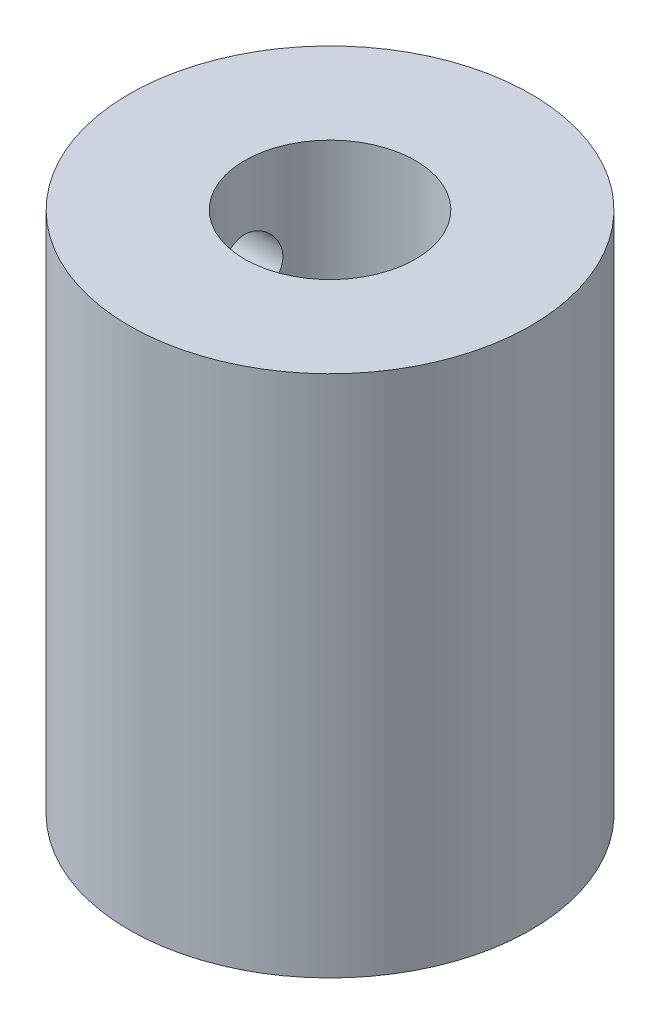
ISO-10303-21;
HEADER;
FILE_DESCRIPTION(('STEP AP214'),'2;1');
FILE_NAME('part.step','',(''),(''),'','','');
FILE_SCHEMA(('AUTOMOTIVE_DESIGN { 1 0 10303 214 1 1 1 1 }'));
ENDSEC;
DATA;
#1=APPLICATION_CONTEXT('core data for automotive mechanical design processes');
#2=APPLICATION_PROTOCOL_DEFINITION('international standard','automotive_design',2000,#1);
#3=PRODUCT_CONTEXT('',#1,'mechanical');
#4=PRODUCT('Part','Part','',(#3));
#5=PRODUCT_RELATED_PRODUCT_CATEGORY('part','',(#4));
#6=PRODUCT_DEFINITION_FORMATION('','',#4);
#7=PRODUCT_DEFINITION_CONTEXT('part definition',#1,'design');
#8=PRODUCT_DEFINITION('design','',#6,#7);
#9=PRODUCT_DEFINITION_SHAPE('','',#8);
#10=(LENGTH_UNIT() NAMED_UNIT(*) SI_UNIT(.MILLI.,.METRE.));
#11=(NAMED_UNIT(*) PLANE_ANGLE_UNIT() SI_UNIT($,.RADIAN.));
#12=(NAMED_UNIT(*) SI_UNIT($,.STERADIAN.) SOLID_ANGLE_UNIT());
#13=UNCERTAINTY_MEASURE_WITH_UNIT(LENGTH_MEASURE(1.E-05),#10,'distance_accuracy_value','');
#14=(GEOMETRIC_REPRESENTATION_CONTEXT(3) GLOBAL_UNCERTAINTY_ASSIGNED_CONTEXT((#13)) GLOBAL_UNIT_ASSIGNED_CONTEXT((#10,
#11,#12)) REPRESENTATION_CONTEXT('',''));
#15=CARTESIAN_POINT('',(0.,0.,0.));
#16=DIRECTION('',(0.,0.,1.));
#17=DIRECTION('',(1.,0.,0.));
#18=AXIS2_PLACEMENT_3D('',#15,#16,#17);
#19=CARTESIAN_POINT('',(0.,24.5,0.));
#20=DIRECTION('',(0.,1.,0.));
#21=DIRECTION('',(0.,0.,1.));
#22=AXIS2_PLACEMENT_3D('',#19,#20,#21);
#23=PLANE('',#22);
#24=CARTESIAN_POINT('',(0.,24.5,0.));
#25=DIRECTION('',(0.,1.,0.));
#26=DIRECTION('',(0.,0.,1.));
#27=AXIS2_PLACEMENT_3D('',#24,#25,#26);
#28=CIRCLE('',#27,9.4);
#29=CARTESIAN_POINT('',(0.,24.5,9.4));
#30=VERTEX_POINT('',#29);
#31=EDGE_CURVE('E10',#30,#30,#28,.T.);
#32=ORIENTED_EDGE('',*,*,#31,.T.);
#33=EDGE_LOOP('',(#32));
#34=FACE_BOUND('',#33,.T.);
#35=CARTESIAN_POINT('',(0.,24.5,0.));
#36=DIRECTION('',(0.,1.,0.));
#37=DIRECTION('',(0.,0.,1.));
#38=AXIS2_PLACEMENT_3D('',#35,#36,#37);
#39=CIRCLE('',#38,4.);
#40=CARTESIAN_POINT('',(0.,24.5,4.));
#41=VERTEX_POINT('',#40);
#42=EDGE_CURVE('E57',#41,#41,#39,.T.);
#43=ORIENTED_EDGE('',*,*,#42,.F.);
#44=EDGE_LOOP('',(#43));
#45=FACE_BOUND('',#44,.T.);
#46=ADVANCED_FACE('F36',(#34,#45),#23,.T.);
#47=CARTESIAN_POINT('',(0.,0.,0.));
#48=DIRECTION('',(0.,1.,0.));
#49=DIRECTION('',(0.,0.,1.));
#50=AXIS2_PLACEMENT_3D('',#47,#48,#49);
#51=PLANE('',#50);
#52=CARTESIAN_POINT('',(0.,0.,0.));
#53=DIRECTION('',(0.,1.,0.));
#54=DIRECTION('',(0.,0.,1.));
#55=AXIS2_PLACEMENT_3D('',#52,#53,#54);
#56=CIRCLE('',#55,9.4);
#57=CARTESIAN_POINT('',(0.,0.,9.4));
#58=VERTEX_POINT('',#57);
#59=EDGE_CURVE('E51',#58,#58,#56,.T.);
#60=ORIENTED_EDGE('',*,*,#59,.F.);
#61=EDGE_LOOP('',(#60));
#62=FACE_BOUND('',#61,.T.);
#63=CARTESIAN_POINT('',(0.,0.,0.));
#64=DIRECTION('',(0.,1.,0.));
#65=DIRECTION('',(0.,0.,1.));
#66=AXIS2_PLACEMENT_3D('',#63,#64,#65);
#67=CIRCLE('',#66,4.);
#68=CARTESIAN_POINT('',(0.,0.,4.));
#69=VERTEX_POINT('',#68);
#70=EDGE_CURVE('E60',#69,#69,#67,.T.);
#71=ORIENTED_EDGE('',*,*,#70,.T.);
#72=EDGE_LOOP('',(#71));
#73=FACE_BOUND('',#72,.T.);
#74=ADVANCED_FACE('F101',(#62,#73),#51,.F.);
#75=CARTESIAN_POINT('',(0.,24.5,0.));
#76=DIRECTION('',(0.,-1.,0.));
#77=DIRECTION('',(0.,0.,-1.));
#78=AXIS2_PLACEMENT_3D('',#75,#76,#77);
#79=CYLINDRICAL_SURFACE('',#78,9.4);
#80=CARTESIAN_POINT('',(-9.4,3.,0.));
#81=CARTESIAN_POINT('',(-9.39999860292908,3.00000339908655,-0.0836857789003803));
#82=CARTESIAN_POINT('',(-9.39887077859171,3.00702696122487,-0.167418496607772));
#83=CARTESIAN_POINT('',(-9.3944802410602,3.0349259578385,-0.332538987483233));
#84=CARTESIAN_POINT('',(-9.3912155141064,3.05581445852151,-0.413924473075796));
#85=CARTESIAN_POINT('',(-9.3829176603132,3.11079950047295,-0.571937358065425));
#86=CARTESIAN_POINT('',(-9.37788593234908,3.14488559583209,-0.648568465040697));
#87=CARTESIAN_POINT('',(-9.36660853273479,3.22527168016775,-0.795012930897301));
#88=CARTESIAN_POINT('',(-9.36036301292473,3.2715701416886,-0.864827140903446));
#89=CARTESIAN_POINT('',(-9.34728990872575,3.37550021958999,-0.996280738714871));
#90=CARTESIAN_POINT('',(-9.34045813044039,3.4332181576055,-1.05785146896413));
#91=CARTESIAN_POINT('',(-9.32701490899077,3.55816299563803,-1.17047757507708));
#92=CARTESIAN_POINT('',(-9.32040347920138,3.62539047157698,-1.22153231360512));
#93=CARTESIAN_POINT('',(-9.30810888738145,3.76791321194938,-1.31194891982853));
#94=CARTESIAN_POINT('',(-9.30243114543986,3.8432516532129,-1.35124352949974));
#95=CARTESIAN_POINT('',(-9.29270458436251,3.99956521487794,-1.41659447142563));
#96=CARTESIAN_POINT('',(-9.28865566456992,4.08053998660654,-1.44265162174584));
#97=CARTESIAN_POINT('',(-9.28268671586333,4.24510227182945,-1.48057299349724));
#98=CARTESIAN_POINT('',(-9.28074898071099,4.32866191384838,-1.49255532610323));
#99=CARTESIAN_POINT('',(-9.27916815661671,4.49662653562471,-1.5023529987421));
#100=CARTESIAN_POINT('',(-9.27952491875279,4.58103146016489,-1.50016925820927));
#101=CARTESIAN_POINT('',(-9.28247660212726,4.74745142467884,-1.48179311664287));
#102=CARTESIAN_POINT('',(-9.28505040396344,4.82948148910245,-1.46573289779084));
#103=CARTESIAN_POINT('',(-9.29211313549312,4.98966755740503,-1.42026690117827));
#104=CARTESIAN_POINT('',(-9.29660212585582,5.06782343847038,-1.39086070064291));
#105=CARTESIAN_POINT('',(-9.30701247834285,5.21844111988442,-1.31940194808493));
#106=CARTESIAN_POINT('',(-9.31294008917152,5.29087620112074,-1.27729402636579));
#107=CARTESIAN_POINT('',(-9.32555537605936,5.4277026315064,-1.18166648494931));
#108=CARTESIAN_POINT('',(-9.33224310843869,5.49209338387938,-1.12814601939762));
#109=CARTESIAN_POINT('',(-9.34571812525718,5.61176889026108,-1.01049009104128));
#110=CARTESIAN_POINT('',(-9.35250567847568,5.66694207592851,-0.94624111357437));
#111=CARTESIAN_POINT('',(-9.36534529074403,5.7657405797876,-0.809337166246673));
#112=CARTESIAN_POINT('',(-9.37139734575783,5.80936583461171,-0.736682150262153));
#113=CARTESIAN_POINT('',(-9.38209162704905,5.88383832828381,-0.584927224574365));
#114=CARTESIAN_POINT('',(-9.38673282558863,5.91467625813522,-0.505822669649441));
#115=CARTESIAN_POINT('',(-9.39407406616499,5.96259806029723,-0.343466737257515));
#116=CARTESIAN_POINT('',(-9.39677425690949,5.97968298628799,-0.260215677992101));
#117=CARTESIAN_POINT('',(-9.3999093795552,5.9994638239439,-0.0928921103699813));
#118=CARTESIAN_POINT('',(-9.40036843752436,6.00231299312803,-0.00883815585294559));
#119=CARTESIAN_POINT('',(-9.3990354729032,5.99394924295871,0.158546581234478));
#120=CARTESIAN_POINT('',(-9.39724352948276,5.98273681816502,0.241877389134836));
#121=CARTESIAN_POINT('',(-9.39162483366102,5.94669562180877,0.404981005546032));
#122=CARTESIAN_POINT('',(-9.38780934440858,5.92194219631544,0.484770884780166));
#123=CARTESIAN_POINT('',(-9.37856979195967,5.85960159951161,0.639068121481985));
#124=CARTESIAN_POINT('',(-9.3731456447838,5.82201375816952,0.713575202911422));
#125=CARTESIAN_POINT('',(-9.36123104450446,5.73471656643136,0.855861163626058));
#126=CARTESIAN_POINT('',(-9.35473225361117,5.68491083200475,0.923580196715583));
#127=CARTESIAN_POINT('',(-9.34141584789389,5.574724941677,1.04975357394106));
#128=CARTESIAN_POINT('',(-9.33459821197453,5.51434408537934,1.10820730394176));
#129=CARTESIAN_POINT('',(-9.32133515201758,5.38403677519269,1.21475432308297));
#130=CARTESIAN_POINT('',(-9.31489385732774,5.31402545535134,1.26274441475431));
#131=CARTESIAN_POINT('',(-9.30318815198079,5.16684513267429,1.34628266474539));
#132=CARTESIAN_POINT('',(-9.29792370634545,5.08967634266899,1.38183119287037));
#133=CARTESIAN_POINT('',(-9.28919827524588,4.93066855257304,1.43932041741957));
#134=CARTESIAN_POINT('',(-9.28573032022974,4.84884898829733,1.46131376569598));
#135=CARTESIAN_POINT('',(-9.2809725798083,4.68261743718157,1.49123486875253));
#136=CARTESIAN_POINT('',(-9.27968262224987,4.59820565577244,1.49916373521905));
#137=CARTESIAN_POINT('',(-9.27943392099984,4.43021544664552,1.50070178740011));
#138=CARTESIAN_POINT('',(-9.28044874617022,4.34663849973592,1.49447332796677));
#139=CARTESIAN_POINT('',(-9.28463755016577,4.18173752238263,1.46822321800111));
#140=CARTESIAN_POINT('',(-9.287811523616,4.10041348633113,1.44820160180518));
#141=CARTESIAN_POINT('',(-9.2959513032301,3.94238183457247,1.39499364428432));
#142=CARTESIAN_POINT('',(-9.30091536252848,3.86566980307003,1.36182013418357));
#143=CARTESIAN_POINT('',(-9.31207786158743,3.71887382095289,1.28326648968871));
#144=CARTESIAN_POINT('',(-9.31827635413694,3.64879015398064,1.23788583324282));
#145=CARTESIAN_POINT('',(-9.33129362625975,3.51641799859779,1.13562205521819));
#146=CARTESIAN_POINT('',(-9.33811842228315,3.45422264607109,1.07861912688003));
#147=CARTESIAN_POINT('',(-9.35157035726145,3.34022375448953,0.954981945128727));
#148=CARTESIAN_POINT('',(-9.3581974501104,3.28842262356852,0.88834546595213));
#149=CARTESIAN_POINT('',(-9.37055524925498,3.19638795348418,0.746837235944878));
#150=CARTESIAN_POINT('',(-9.37628006375307,3.15622911582005,0.671916387125346));
#151=CARTESIAN_POINT('',(-9.38613080657795,3.08912723429793,0.516333748405034));
#152=CARTESIAN_POINT('',(-9.39025835436346,3.06217079720164,0.435677871978858));
#153=CARTESIAN_POINT('',(-9.39553054266368,3.02820615337028,0.295572402618494));
#154=CARTESIAN_POINT('',(-9.39719778508943,3.01764544341047,0.236978205994379));
#155=CARTESIAN_POINT('',(-9.39943300196921,3.00354121149885,0.118930567589197));
#156=CARTESIAN_POINT('',(-9.40000099292594,2.99999758420194,0.0594771387209914));
#157=CARTESIAN_POINT('',(-9.4,3.,0.));
#158=B_SPLINE_CURVE_WITH_KNOTS('',3,(#80,#81,#82,#83,#84,#85,#86,#87,#88,#89,#90,#91,#92,#93,
#94,#95,#96,#97,#98,#99,#100,#101,#102,#103,#104,#105,#106,#107,#108,#109,#110,#111,#112,#113,
#114,#115,#116,#117,#118,#119,#120,#121,#122,#123,#124,#125,#126,#127,#128,#129,#130,#131,#132,
#133,#134,#135,#136,#137,#138,#139,#140,#141,#142,#143,#144,#145,#146,#147,#148,#149,#150,#151,
#152,#153,#154,#155,#156,#157),.UNSPECIFIED.,.T.,.F.,(4,2,2,2,2,2,2,2,2,2,2,2,2,2,2,2,2,2,2,2,2,
2,2,2,2,2,2,2,2,2,2,2,2,2,2,2,2,2,4),(0.,0.250839961665604,0.50191664917309,0.752795014147739,
1.00364201550154,1.25646311863702,1.50929953982558,1.76355549094707,2.0177957273208,
2.26988686702206,2.52196164517307,2.77166139768042,3.02136906074377,3.27218138553335,
3.52301230604393,3.77668826525693,4.0303656164498,4.2842273184147,4.53806956902889,
4.78917305817339,5.04026771601461,5.28997921531406,5.53970375300837,5.79146550750159,
6.04324394263323,6.29740324834593,6.5515549989451,6.80471323165459,7.05785145331003,
7.30810137611369,7.55835067595277,7.80835642652347,8.05837287056011,8.3111102507431,
8.56390611770033,8.81828983379431,9.07241495181823,9.2506945517148,9.42897147513942),.UNSPECIFIED.);
#159=CARTESIAN_POINT('',(-9.4,3.,0.));
#160=VERTEX_POINT('',#159);
#161=EDGE_CURVE('E87',#160,#160,#158,.T.);
#162=ORIENTED_EDGE('',*,*,#161,.T.);
#163=EDGE_LOOP('',(#162));
#164=FACE_BOUND('',#163,.T.);
#165=CARTESIAN_POINT('',(-9.4,18.5,0.));
#166=CARTESIAN_POINT('',(-9.39999860292908,18.5000033990866,-0.0836857789003804));
#167=CARTESIAN_POINT('',(-9.39887077859171,18.5070269612249,-0.167418496607772));
#168=CARTESIAN_POINT('',(-9.3944802410602,18.5349259578385,-0.332538987483233));
#169=CARTESIAN_POINT('',(-9.3912155141064,18.5558144585215,-0.413924473075796));
#170=CARTESIAN_POINT('',(-9.3829176603132,18.610799500473,-0.571937358065426));
#171=CARTESIAN_POINT('',(-9.37788593234908,18.6448855958321,-0.648568465040698));
#172=CARTESIAN_POINT('',(-9.36660853273479,18.7252716801677,-0.795012930897303));
#173=CARTESIAN_POINT('',(-9.36036301292473,18.7715701416886,-0.864827140903447));
#174=CARTESIAN_POINT('',(-9.34728990872575,18.87550021959,-0.996280738714872));
#175=CARTESIAN_POINT('',(-9.34045813044039,18.9332181576055,-1.05785146896413));
#176=CARTESIAN_POINT('',(-9.32701490899077,19.058162995638,-1.17047757507708));
#177=CARTESIAN_POINT('',(-9.32040347920138,19.125390471577,-1.22153231360512));
#178=CARTESIAN_POINT('',(-9.30810888738145,19.2679132119494,-1.31194891982853));
#179=CARTESIAN_POINT('',(-9.30243114543986,19.3432516532129,-1.35124352949974));
#180=CARTESIAN_POINT('',(-9.29270458436251,19.4995652148779,-1.41659447142564));
#181=CARTESIAN_POINT('',(-9.28865566456992,19.5805399866065,-1.44265162174584));
#182=CARTESIAN_POINT('',(-9.28268671586333,19.7451022718294,-1.48057299349724));
#183=CARTESIAN_POINT('',(-9.28074898071099,19.8286619138484,-1.49255532610323));
#184=CARTESIAN_POINT('',(-9.27916815661671,19.9966265356247,-1.5023529987421));
#185=CARTESIAN_POINT('',(-9.27952491875279,20.0810314601649,-1.50016925820927));
#186=CARTESIAN_POINT('',(-9.28247660212726,20.2474514246788,-1.48179311664287));
#187=CARTESIAN_POINT('',(-9.28505040396344,20.3294814891024,-1.46573289779084));
#188=CARTESIAN_POINT('',(-9.29211313549312,20.489667557405,-1.42026690117827));
#189=CARTESIAN_POINT('',(-9.29660212585582,20.5678234384704,-1.39086070064291));
#190=CARTESIAN_POINT('',(-9.30701247834285,20.7184411198844,-1.31940194808493));
#191=CARTESIAN_POINT('',(-9.31294008917152,20.7908762011207,-1.27729402636579));
#192=CARTESIAN_POINT('',(-9.32555537605936,20.9277026315064,-1.18166648494931));
#193=CARTESIAN_POINT('',(-9.33224310843869,20.9920933838794,-1.12814601939762));
#194=CARTESIAN_POINT('',(-9.34571812525718,21.1117688902611,-1.01049009104127));
#195=CARTESIAN_POINT('',(-9.35250567847568,21.1669420759285,-0.946241113574369));
#196=CARTESIAN_POINT('',(-9.36534529074403,21.2657405797876,-0.809337166246673));
#197=CARTESIAN_POINT('',(-9.37139734575783,21.3093658346117,-0.736682150262153));
#198=CARTESIAN_POINT('',(-9.38209162704905,21.3838383282838,-0.584927224574364));
#199=CARTESIAN_POINT('',(-9.38673282558863,21.4146762581352,-0.50582266964944));
#200=CARTESIAN_POINT('',(-9.39407406616499,21.4625980602972,-0.343466737257514));
#201=CARTESIAN_POINT('',(-9.39677425690949,21.479682986288,-0.2602156779921));
#202=CARTESIAN_POINT('',(-9.3999093795552,21.4994638239439,-0.0928921103699806));
#203=CARTESIAN_POINT('',(-9.40036843752436,21.502312993128,-0.00883815585294493));
#204=CARTESIAN_POINT('',(-9.3990354729032,21.4939492429587,0.158546581234479));
#205=CARTESIAN_POINT('',(-9.39724352948276,21.482736818165,0.241877389134837));
#206=CARTESIAN_POINT('',(-9.39162483366102,21.4466956218088,0.404981005546033));
#207=CARTESIAN_POINT('',(-9.38780934440858,21.4219421963154,0.484770884780167));
#208=CARTESIAN_POINT('',(-9.37856979195967,21.3596015995116,0.639068121481986));
#209=CARTESIAN_POINT('',(-9.3731456447838,21.3220137581695,0.713575202911423));
#210=CARTESIAN_POINT('',(-9.36123104450446,21.2347165664314,0.855861163626059));
#211=CARTESIAN_POINT('',(-9.35473225361117,21.1849108320047,0.923580196715583));
#212=CARTESIAN_POINT('',(-9.34141584789389,21.074724941677,1.04975357394106));
#213=CARTESIAN_POINT('',(-9.33459821197453,21.0143440853793,1.10820730394176));
#214=CARTESIAN_POINT('',(-9.32133515201758,20.8840367751927,1.21475432308297));
#215=CARTESIAN_POINT('',(-9.31489385732774,20.8140254553513,1.26274441475431));
#216=CARTESIAN_POINT('',(-9.30318815198079,20.6668451326743,1.34628266474539));
#217=CARTESIAN_POINT('',(-9.29792370634545,20.589676342669,1.38183119287038));
#218=CARTESIAN_POINT('',(-9.28919827524588,20.430668552573,1.43932041741957));
#219=CARTESIAN_POINT('',(-9.28573032022974,20.3488489882973,1.46131376569598));
#220=CARTESIAN_POINT('',(-9.2809725798083,20.1826174371816,1.49123486875253));
#221=CARTESIAN_POINT('',(-9.27968262224987,20.0982056557724,1.49916373521905));
#222=CARTESIAN_POINT('',(-9.27943392099984,19.9302154466455,1.50070178740011));
#223=CARTESIAN_POINT('',(-9.28044874617022,19.8466384997359,1.49447332796677));
#224=CARTESIAN_POINT('',(-9.28463755016577,19.6817375223826,1.46822321800111));
#225=CARTESIAN_POINT('',(-9.287811523616,19.6004134863311,1.44820160180518));
#226=CARTESIAN_POINT('',(-9.2959513032301,19.4423818345725,1.39499364428432));
#227=CARTESIAN_POINT('',(-9.30091536252848,19.36566980307,1.36182013418357));
#228=CARTESIAN_POINT('',(-9.31207786158743,19.2188738209529,1.28326648968871));
#229=CARTESIAN_POINT('',(-9.31827635413694,19.1487901539806,1.23788583324282));
#230=CARTESIAN_POINT('',(-9.33129362625975,19.0164179985978,1.13562205521819));
#231=CARTESIAN_POINT('',(-9.33811842228315,18.9542226460711,1.07861912688003));
#232=CARTESIAN_POINT('',(-9.35157035726145,18.8402237544895,0.954981945128728));
#233=CARTESIAN_POINT('',(-9.3581974501104,18.7884226235685,0.88834546595213));
#234=CARTESIAN_POINT('',(-9.37055524925498,18.6963879534842,0.746837235944877));
#235=CARTESIAN_POINT('',(-9.37628006375307,18.6562291158201,0.671916387125345));
#236=CARTESIAN_POINT('',(-9.38613080657795,18.5891272342979,0.516333748405034));
#237=CARTESIAN_POINT('',(-9.39025835436346,18.5621707972016,0.435677871978858));
#238=CARTESIAN_POINT('',(-9.39553054266368,18.5282061533703,0.295572402618495));
#239=CARTESIAN_POINT('',(-9.39719778508943,18.5176454434105,0.23697820599438));
#240=CARTESIAN_POINT('',(-9.39943300196921,18.5035412114988,0.118930567589197));
#241=CARTESIAN_POINT('',(-9.40000099292594,18.4999975842019,0.0594771387209916));
#242=CARTESIAN_POINT('',(-9.4,18.5,0.));
#243=B_SPLINE_CURVE_WITH_KNOTS('',3,(#165,#166,#167,#168,#169,#170,#171,#172,#173,#174,#175,
#176,#177,#178,#179,#180,#181,#182,#183,#184,#185,#186,#187,#188,#189,#190,#191,#192,#193,#194,
#195,#196,#197,#198,#199,#200,#201,#202,#203,#204,#205,#206,#207,#208,#209,#210,#211,#212,#213,
#214,#215,#216,#217,#218,#219,#220,#221,#222,#223,#224,#225,#226,#227,#228,#229,#230,#231,#232,
#233,#234,#235,#236,#237,#238,#239,#240,#241,#242),.UNSPECIFIED.,.T.,.F.,(4,2,2,2,2,2,2,2,2,2,2,
2,2,2,2,2,2,2,2,2,2,2,2,2,2,2,2,2,2,2,2,2,2,2,2,2,2,2,4),(0.,0.250839961665604,
0.501916649173092,0.75279501414774,1.00364201550154,1.25646311863703,1.50929953982558,
1.76355549094707,2.0177957273208,2.26988686702206,2.52196164517307,2.77166139768042,
3.02136906074377,3.27218138553335,3.52301230604394,3.77668826525693,4.0303656164498,
4.2842273184147,4.53806956902889,4.7891730581734,5.04026771601461,5.28997921531406,
5.53970375300837,5.79146550750159,6.04324394263324,6.29740324834594,6.55155499894511,
6.8047132316546,7.05785145331004,7.30810137611369,7.55835067595278,7.80835642652348,
8.05837287056012,8.31111025074311,8.56390611770034,8.81828983379431,9.07241495181824,
9.2506945517148,9.42897147513943),.UNSPECIFIED.);
#244=CARTESIAN_POINT('',(-9.4,18.5,0.));
#245=VERTEX_POINT('',#244);
#246=EDGE_CURVE('E69',#245,#245,#243,.T.);
#247=ORIENTED_EDGE('',*,*,#246,.T.);
#248=EDGE_LOOP('',(#247));
#249=FACE_BOUND('',#248,.T.);
#250=ORIENTED_EDGE('',*,*,#31,.F.);
#251=EDGE_LOOP('',(#250));
#252=FACE_BOUND('',#251,.T.);
#253=ORIENTED_EDGE('',*,*,#59,.T.);
#254=EDGE_LOOP('',(#253));
#255=FACE_BOUND('',#254,.T.);
#256=ADVANCED_FACE('F38',(#164,#249,#252,#255),#79,.T.);
#257=CARTESIAN_POINT('',(0.,24.5,0.));
#258=DIRECTION('',(0.,-1.,0.));
#259=DIRECTION('',(0.,0.,-1.));
#260=AXIS2_PLACEMENT_3D('',#257,#258,#259);
#261=CYLINDRICAL_SURFACE('',#260,4.);
#262=CARTESIAN_POINT('',(-3.70809924354783,4.5,-1.5));
#263=CARTESIAN_POINT('',(-3.70809640633806,4.58100748372079,-1.50000304106109));
#264=CARTESIAN_POINT('',(-3.71078260240986,4.66199492250364,-1.49341597549487));
#265=CARTESIAN_POINT('',(-3.72116159304967,4.8215280829132,-1.46736187895468));
#266=CARTESIAN_POINT('',(-3.72885423767112,4.90007387759501,-1.44789523373263));
#267=CARTESIAN_POINT('',(-3.748254802809,5.05237537161353,-1.39689657610574));
#268=CARTESIAN_POINT('',(-3.7599530956926,5.12614205665108,-1.36539347266348));
#269=CARTESIAN_POINT('',(-3.78603134206598,5.26737189681884,-1.29131856742698));
#270=CARTESIAN_POINT('',(-3.80041210067323,5.33483315028252,-1.24874344095039));
#271=CARTESIAN_POINT('',(-3.83103574665713,5.46489031162282,-1.15146661374162));
#272=CARTESIAN_POINT('',(-3.84733341923603,5.52712852962939,-1.09630381213306));
#273=CARTESIAN_POINT('',(-3.87949750628547,5.64172281467149,-0.976395839778925));
#274=CARTESIAN_POINT('',(-3.89536382814785,5.69407677374185,-0.911648630256679));
#275=CARTESIAN_POINT('',(-3.92552873936553,5.78913951229561,-0.7716946551776));
#276=CARTESIAN_POINT('',(-3.93975561223505,5.83145947471586,-0.696206947538027));
#277=CARTESIAN_POINT('',(-3.96438007973848,5.90265117252491,-0.538555771965246));
#278=CARTESIAN_POINT('',(-3.97477900217006,5.93152757199197,-0.456394630933535));
#279=CARTESIAN_POINT('',(-3.9901869710344,5.97375789577462,-0.291489341676831));
#280=CARTESIAN_POINT('',(-3.99540915214774,5.98772762744046,-0.208923197281595));
#281=CARTESIAN_POINT('',(-4.0006401410794,6.00172120094499,-0.042464363794785));
#282=CARTESIAN_POINT('',(-4.00065064414902,6.00174957761871,0.0414278850628339));
#283=CARTESIAN_POINT('',(-3.99559265903894,5.98821823853483,0.203743543064477));
#284=CARTESIAN_POINT('',(-3.99077541996683,5.97533070205119,0.282232178266901));
#285=CARTESIAN_POINT('',(-3.97693274932263,5.93746408477445,0.435839217984392));
#286=CARTESIAN_POINT('',(-3.96790701975577,5.91248414773796,0.510957383430299));
#287=CARTESIAN_POINT('',(-3.9463776916753,5.85082954832415,0.656989017303105));
#288=CARTESIAN_POINT('',(-3.93382539470077,5.81398999473159,0.72782539228731));
#289=CARTESIAN_POINT('',(-3.90651310225279,5.72980790307061,0.86248660795756));
#290=CARTESIAN_POINT('',(-3.8917523951284,5.6824619769824,0.926309176932323));
#291=CARTESIAN_POINT('',(-3.86052529655816,5.57537271371681,1.04909048680094));
#292=CARTESIAN_POINT('',(-3.84400963763883,5.51506608434957,1.10754614526348));
#293=CARTESIAN_POINT('',(-3.81182460645722,5.38540700667844,1.21370395569342));
#294=CARTESIAN_POINT('',(-3.79615544748847,5.31605229341336,1.261403406929));
#295=CARTESIAN_POINT('',(-3.76712703500335,5.16828053253718,1.34565611808152));
#296=CARTESIAN_POINT('',(-3.75382677150277,5.08969650631393,1.38193847851831));
#297=CARTESIAN_POINT('',(-3.73172438629002,4.92690377483243,1.44056464441501));
#298=CARTESIAN_POINT('',(-3.72291976205783,4.84269822840631,1.46291620605595));
#299=CARTESIAN_POINT('',(-3.71139597222848,4.67602403768405,1.49190191709668));
#300=CARTESIAN_POINT('',(-3.70836785241537,4.59371589446386,1.49933521158966));
#301=CARTESIAN_POINT('',(-3.70786539525016,4.42899064325826,1.50057885636272));
#302=CARTESIAN_POINT('',(-3.71038967003987,4.34657356764753,1.49439261093762));
#303=CARTESIAN_POINT('',(-3.72039381629735,4.18807007771232,1.46929733520157));
#304=CARTESIAN_POINT('',(-3.72763276216449,4.11186886423534,1.45100618334224));
#305=CARTESIAN_POINT('',(-3.74596487046362,3.9636520552798,1.40299774640637));
#306=CARTESIAN_POINT('',(-3.75705882250173,3.89163732083186,1.37327812034623));
#307=CARTESIAN_POINT('',(-3.7823624311608,3.75083556192379,1.30200292275278));
#308=CARTESIAN_POINT('',(-3.79667328892065,3.68227070786266,1.26004545177047));
#309=CARTESIAN_POINT('',(-3.82662814294291,3.55287101827396,1.16591317862479));
#310=CARTESIAN_POINT('',(-3.84227262594077,3.49203902537537,1.11373463696435));
#311=CARTESIAN_POINT('',(-3.87433046553184,3.3758316268049,0.996727340900938));
#312=CARTESIAN_POINT('',(-3.89072969357028,3.32104659123125,0.931306341491061));
#313=CARTESIAN_POINT('',(-3.92149874963302,3.22316163241056,0.79179747175315));
#314=CARTESIAN_POINT('',(-3.93586857107664,3.18006174705416,0.717709573322673));
#315=CARTESIAN_POINT('',(-3.96094985704552,3.10705394380039,0.563016329468476));
#316=CARTESIAN_POINT('',(-3.9716738133801,3.0771008762074,0.482434433064626));
#317=CARTESIAN_POINT('',(-3.98829436712571,3.03134358615008,0.316881887523254));
#318=CARTESIAN_POINT('',(-3.99419323299412,3.0155327145776,0.231913320723592));
#319=CARTESIAN_POINT('',(-4.00028407317073,2.99922559724517,0.0653355852738143));
#320=CARTESIAN_POINT('',(-4.00078860953764,2.99789051694101,-0.0161807680608464));
#321=CARTESIAN_POINT('',(-3.99684889809223,3.00841515944539,-0.178226786412425));
#322=CARTESIAN_POINT('',(-3.9924052471313,3.02027329088586,-0.258756569245258));
#323=CARTESIAN_POINT('',(-3.97921089603771,3.05625885149362,-0.414548248377127));
#324=CARTESIAN_POINT('',(-3.97056791378017,3.08007990587836,-0.489890731068835));
#325=CARTESIAN_POINT('',(-3.9498778362099,3.13901001338436,-0.63551547300639));
#326=CARTESIAN_POINT('',(-3.93783009655664,3.17412120330475,-0.705796771275543));
#327=CARTESIAN_POINT('',(-3.91090618300074,3.25631394350481,-0.842540176994414));
#328=CARTESIAN_POINT('',(-3.89593240108828,3.30383664051415,-0.908717548846851));
#329=CARTESIAN_POINT('',(-3.86499507694844,3.40880783018761,-1.03241734752336));
#330=CARTESIAN_POINT('',(-3.84903118274027,3.46625986580788,-1.0899366712559));
#331=CARTESIAN_POINT('',(-3.81688129739175,3.59306413164506,-1.19781214236196));
#332=CARTESIAN_POINT('',(-3.8007280534916,3.66288440215431,-1.24762999816025));
#333=CARTESIAN_POINT('',(-3.77098325003638,3.81041586957333,-1.33484709556843));
#334=CARTESIAN_POINT('',(-3.75739195631216,3.88812788405348,-1.37224504878157));
#335=CARTESIAN_POINT('',(-3.73402269853266,4.05295568097541,-1.4346588697426));
#336=CARTESIAN_POINT('',(-3.7244380329086,4.14033436651178,-1.45906002899523));
#337=CARTESIAN_POINT('',(-3.71147994336315,4.31848527195579,-1.49172356722079));
#338=CARTESIAN_POINT('',(-3.70810242179736,4.40925521270999,-1.49999659339571));
#339=CARTESIAN_POINT('',(-3.70809924354783,4.5,-1.5));
#340=B_SPLINE_CURVE_WITH_KNOTS('',3,(#262,#263,#264,#265,#266,#267,#268,#269,#270,#271,#272,
#273,#274,#275,#276,#277,#278,#279,#280,#281,#282,#283,#284,#285,#286,#287,#288,#289,#290,#291,
#292,#293,#294,#295,#296,#297,#298,#299,#300,#301,#302,#303,#304,#305,#306,#307,#308,#309,#310,
#311,#312,#313,#314,#315,#316,#317,#318,#319,#320,#321,#322,#323,#324,#325,#326,#327,#328,#329,
#330,#331,#332,#333,#334,#335,#336,#337,#338,#339),.UNSPECIFIED.,.T.,.F.,(4,2,2,2,2,2,2,2,2,2,2,
2,2,2,2,2,2,2,2,2,2,2,2,2,2,2,2,2,2,2,2,2,2,2,2,2,2,2,4),(0.,0.24268454141617,0.485361814598855,
0.72745985675703,0.969630679682933,1.22274652401128,1.47591628822983,1.73770072136421,
1.9993942638133,2.24980018489679,2.50012465404857,2.73806472803194,2.97602165263335,
3.21744131210668,3.45893893628976,3.71456675065875,3.97025867827335,4.23162592252967,
4.49284751635474,4.73965657740485,4.98640395388885,5.22143845928199,5.45652113429526,
5.70041561005822,5.94439948466355,6.20385016993624,6.46330169650178,6.72185508890168,
6.98028685560127,7.22365720549936,7.4669982031948,7.7044027400389,7.94185223512831,
8.18928323676987,8.43680270894965,8.69738599542079,8.95799630544242,9.23003178870926,
9.50188762323053),.UNSPECIFIED.);
#341=CARTESIAN_POINT('',(-3.70809924354783,4.5,-1.5));
#342=VERTEX_POINT('',#341);
#343=EDGE_CURVE('E41',#342,#342,#340,.T.);
#344=ORIENTED_EDGE('',*,*,#343,.F.);
#345=EDGE_LOOP('',(#344));
#346=FACE_BOUND('',#345,.T.);
#347=CARTESIAN_POINT('',(-3.70809924354783,20.,-1.5));
#348=CARTESIAN_POINT('',(-3.70809640633806,20.0810074837208,-1.50000304106109));
#349=CARTESIAN_POINT('',(-3.71078260240986,20.1619949225036,-1.49341597549487));
#350=CARTESIAN_POINT('',(-3.72116159304967,20.3215280829132,-1.46736187895468));
#351=CARTESIAN_POINT('',(-3.72885423767112,20.400073877595,-1.44789523373263));
#352=CARTESIAN_POINT('',(-3.748254802809,20.5523753716135,-1.39689657610574));
#353=CARTESIAN_POINT('',(-3.7599530956926,20.6261420566511,-1.36539347266348));
#354=CARTESIAN_POINT('',(-3.78603134206598,20.7673718968188,-1.29131856742698));
#355=CARTESIAN_POINT('',(-3.80041210067323,20.8348331502825,-1.24874344095039));
#356=CARTESIAN_POINT('',(-3.83103574665713,20.9648903116228,-1.15146661374162));
#357=CARTESIAN_POINT('',(-3.84733341923603,21.0271285296294,-1.09630381213306));
#358=CARTESIAN_POINT('',(-3.87949750628547,21.1417228146715,-0.976395839778928));
#359=CARTESIAN_POINT('',(-3.89536382814785,21.1940767737419,-0.911648630256682));
#360=CARTESIAN_POINT('',(-3.92552873936553,21.2891395122956,-0.771694655177603));
#361=CARTESIAN_POINT('',(-3.93975561223505,21.3314594747159,-0.69620694753803));
#362=CARTESIAN_POINT('',(-3.96438007973847,21.4026511725249,-0.53855577196525));
#363=CARTESIAN_POINT('',(-3.97477900217006,21.431527571992,-0.456394630933538));
#364=CARTESIAN_POINT('',(-3.9901869710344,21.4737578957746,-0.291489341676833));
#365=CARTESIAN_POINT('',(-3.99540915214774,21.4877276274405,-0.208923197281597));
#366=CARTESIAN_POINT('',(-4.0006401410794,21.501721200945,-0.0424643637947866));
#367=CARTESIAN_POINT('',(-4.00065064414902,21.5017495776187,0.0414278850628326));
#368=CARTESIAN_POINT('',(-3.99559265903894,21.4882182385348,0.203743543064476));
#369=CARTESIAN_POINT('',(-3.99077541996683,21.4753307020512,0.2822321782669));
#370=CARTESIAN_POINT('',(-3.97693274932263,21.4374640847744,0.435839217984391));
#371=CARTESIAN_POINT('',(-3.96790701975577,21.412484147738,0.510957383430298));
#372=CARTESIAN_POINT('',(-3.94637769167531,21.3508295483242,0.656989017303104));
#373=CARTESIAN_POINT('',(-3.93382539470077,21.3139899947316,0.72782539228731));
#374=CARTESIAN_POINT('',(-3.90651310225279,21.2298079030706,0.862486607957561));
#375=CARTESIAN_POINT('',(-3.8917523951284,21.1824619769824,0.926309176932324));
#376=CARTESIAN_POINT('',(-3.86052529655816,21.0753727137168,1.04909048680094));
#377=CARTESIAN_POINT('',(-3.84400963763883,21.0150660843496,1.10754614526348));
#378=CARTESIAN_POINT('',(-3.81182460645722,20.8854070066784,1.21370395569343));
#379=CARTESIAN_POINT('',(-3.79615544748847,20.8160522934134,1.261403406929));
#380=CARTESIAN_POINT('',(-3.76712703500335,20.6682805325372,1.34565611808152));
#381=CARTESIAN_POINT('',(-3.75382677150277,20.5896965063139,1.38193847851831));
#382=CARTESIAN_POINT('',(-3.73172438629002,20.4269037748324,1.44056464441501));
#383=CARTESIAN_POINT('',(-3.72291976205783,20.3426982284063,1.46291620605595));
#384=CARTESIAN_POINT('',(-3.71139597222848,20.176024037684,1.49190191709668));
#385=CARTESIAN_POINT('',(-3.70836785241537,20.0937158944639,1.49933521158966));
#386=CARTESIAN_POINT('',(-3.70786539525016,19.9289906432583,1.50057885636272));
#387=CARTESIAN_POINT('',(-3.71038967003987,19.8465735676475,1.49439261093762));
#388=CARTESIAN_POINT('',(-3.72039381629735,19.6880700777123,1.46929733520157));
#389=CARTESIAN_POINT('',(-3.72763276216449,19.6118688642353,1.45100618334225));
#390=CARTESIAN_POINT('',(-3.74596487046361,19.4636520552798,1.40299774640638));
#391=CARTESIAN_POINT('',(-3.75705882250172,19.3916373208319,1.37327812034623));
#392=CARTESIAN_POINT('',(-3.7823624311608,19.2508355619238,1.30200292275278));
#393=CARTESIAN_POINT('',(-3.79667328892065,19.1822707078627,1.26004545177047));
#394=CARTESIAN_POINT('',(-3.82662814294291,19.052871018274,1.16591317862479));
#395=CARTESIAN_POINT('',(-3.84227262594077,18.9920390253754,1.11373463696435));
#396=CARTESIAN_POINT('',(-3.87433046553184,18.8758316268049,0.996727340900939));
#397=CARTESIAN_POINT('',(-3.89072969357027,18.8210465912312,0.931306341491063));
#398=CARTESIAN_POINT('',(-3.92149874963302,18.7231616324106,0.791797471753153));
#399=CARTESIAN_POINT('',(-3.93586857107664,18.6800617470542,0.717709573322676));
#400=CARTESIAN_POINT('',(-3.96094985704552,18.6070539438004,0.56301632946848));
#401=CARTESIAN_POINT('',(-3.9716738133801,18.5771008762074,0.48243443306463));
#402=CARTESIAN_POINT('',(-3.98829436712571,18.5313435861501,0.316881887523257));
#403=CARTESIAN_POINT('',(-3.99419323299412,18.5155327145776,0.231913320723595));
#404=CARTESIAN_POINT('',(-4.00028407317073,18.4992255972452,0.0653355852738176));
#405=CARTESIAN_POINT('',(-4.00078860953764,18.497890516941,-0.0161807680608432));
#406=CARTESIAN_POINT('',(-3.99684889809224,18.5084151594454,-0.178226786412422));
#407=CARTESIAN_POINT('',(-3.9924052471313,18.5202732908859,-0.258756569245256));
#408=CARTESIAN_POINT('',(-3.97921089603771,18.5562588514936,-0.414548248377125));
#409=CARTESIAN_POINT('',(-3.97056791378017,18.5800799058784,-0.489890731068833));
#410=CARTESIAN_POINT('',(-3.9498778362099,18.6390100133844,-0.635515473006389));
#411=CARTESIAN_POINT('',(-3.93783009655664,18.6741212033048,-0.705796771275541));
#412=CARTESIAN_POINT('',(-3.91090618300074,18.7563139435048,-0.842540176994412));
#413=CARTESIAN_POINT('',(-3.89593240108828,18.8038366405141,-0.908717548846849));
#414=CARTESIAN_POINT('',(-3.86499507694844,18.9088078301876,-1.03241734752336));
#415=CARTESIAN_POINT('',(-3.84903118274027,18.9662598658079,-1.0899366712559));
#416=CARTESIAN_POINT('',(-3.81688129739175,19.0930641316451,-1.19781214236196));
#417=CARTESIAN_POINT('',(-3.8007280534916,19.1628844021543,-1.24762999816025));
#418=CARTESIAN_POINT('',(-3.77098325003638,19.3104158695733,-1.33484709556843));
#419=CARTESIAN_POINT('',(-3.75739195631216,19.3881278840535,-1.37224504878157));
#420=CARTESIAN_POINT('',(-3.73402269853266,19.5529556809754,-1.4346588697426));
#421=CARTESIAN_POINT('',(-3.7244380329086,19.6403343665118,-1.45906002899523));
#422=CARTESIAN_POINT('',(-3.71147994336315,19.8184852719558,-1.49172356722079));
#423=CARTESIAN_POINT('',(-3.70810242179736,19.90925521271,-1.49999659339571));
#424=CARTESIAN_POINT('',(-3.70809924354783,20.,-1.5));
#425=B_SPLINE_CURVE_WITH_KNOTS('',3,(#347,#348,#349,#350,#351,#352,#353,#354,#355,#356,#357,
#358,#359,#360,#361,#362,#363,#364,#365,#366,#367,#368,#369,#370,#371,#372,#373,#374,#375,#376,
#377,#378,#379,#380,#381,#382,#383,#384,#385,#386,#387,#388,#389,#390,#391,#392,#393,#394,#395,
#396,#397,#398,#399,#400,#401,#402,#403,#404,#405,#406,#407,#408,#409,#410,#411,#412,#413,#414,
#415,#416,#417,#418,#419,#420,#421,#422,#423,#424),.UNSPECIFIED.,.T.,.F.,(4,2,2,2,2,2,2,2,2,2,2,
2,2,2,2,2,2,2,2,2,2,2,2,2,2,2,2,2,2,2,2,2,2,2,2,2,2,2,4),(0.,0.242684541416171,
0.485361814598854,0.727459856757032,0.969630679682935,1.22274652401128,1.47591628822983,
1.73770072136421,1.9993942638133,2.24980018489679,2.50012465404857,2.73806472803194,
2.97602165263335,3.21744131210668,3.45893893628976,3.71456675065875,3.97025867827335,
4.23162592252966,4.49284751635474,4.73965657740485,4.98640395388884,5.22143845928199,
5.45652113429527,5.70041561005822,5.94439948466356,6.20385016993624,6.46330169650178,
6.72185508890169,6.98028685560127,7.22365720549936,7.4669982031948,7.70440274003891,
7.94185223512831,8.18928323676987,8.43680270894965,8.6973859954208,8.95799630544243,
9.23003178870927,9.50188762323054),.UNSPECIFIED.);
#426=CARTESIAN_POINT('',(-3.70809924354783,20.,-1.5));
#427=VERTEX_POINT('',#426);
#428=EDGE_CURVE('E62',#427,#427,#425,.T.);
#429=ORIENTED_EDGE('',*,*,#428,.F.);
#430=EDGE_LOOP('',(#429));
#431=FACE_BOUND('',#430,.T.);
#432=ORIENTED_EDGE('',*,*,#42,.T.);
#433=EDGE_LOOP('',(#432));
#434=FACE_BOUND('',#433,.T.);
#435=ORIENTED_EDGE('',*,*,#70,.F.);
#436=EDGE_LOOP('',(#435));
#437=FACE_BOUND('',#436,.T.);
#438=ADVANCED_FACE('F70',(#346,#431,#434,#437),#261,.F.);
#439=CARTESIAN_POINT('',(-9.4,20.,0.));
#440=DIRECTION('',(1.,0.,0.));
#441=DIRECTION('',(0.,0.,-1.));
#442=AXIS2_PLACEMENT_3D('',#439,#440,#441);
#443=CYLINDRICAL_SURFACE('',#442,1.5);
#444=ORIENTED_EDGE('',*,*,#428,.T.);
#445=EDGE_LOOP('',(#444));
#446=FACE_BOUND('',#445,.T.);
#447=ORIENTED_EDGE('',*,*,#246,.F.);
#448=EDGE_LOOP('',(#447));
#449=FACE_BOUND('',#448,.T.);
#450=ADVANCED_FACE('F73',(#446,#449),#443,.F.);
#451=CARTESIAN_POINT('',(-9.4,4.5,0.));
#452=DIRECTION('',(1.,0.,0.));
#453=DIRECTION('',(0.,0.,-1.));
#454=AXIS2_PLACEMENT_3D('',#451,#452,#453);
#455=CYLINDRICAL_SURFACE('',#454,1.5);
#456=ORIENTED_EDGE('',*,*,#343,.T.);
#457=EDGE_LOOP('',(#456));
#458=FACE_BOUND('',#457,.T.);
#459=ORIENTED_EDGE('',*,*,#161,.F.);
#460=EDGE_LOOP('',(#459));
#461=FACE_BOUND('',#460,.T.);
#462=ADVANCED_FACE('F76',(#458,#461),#455,.F.);
#463=CLOSED_SHELL('',(#46,#74,#256,#438,#450,#462));
#464=MANIFOLD_SOLID_BREP('B2',#463);
#465=ADVANCED_BREP_SHAPE_REPRESENTATION('',(#18,#464),#14);
#466=SHAPE_DEFINITION_REPRESENTATION(#9,#465);
ENDSEC;
END-ISO-10303-21;
